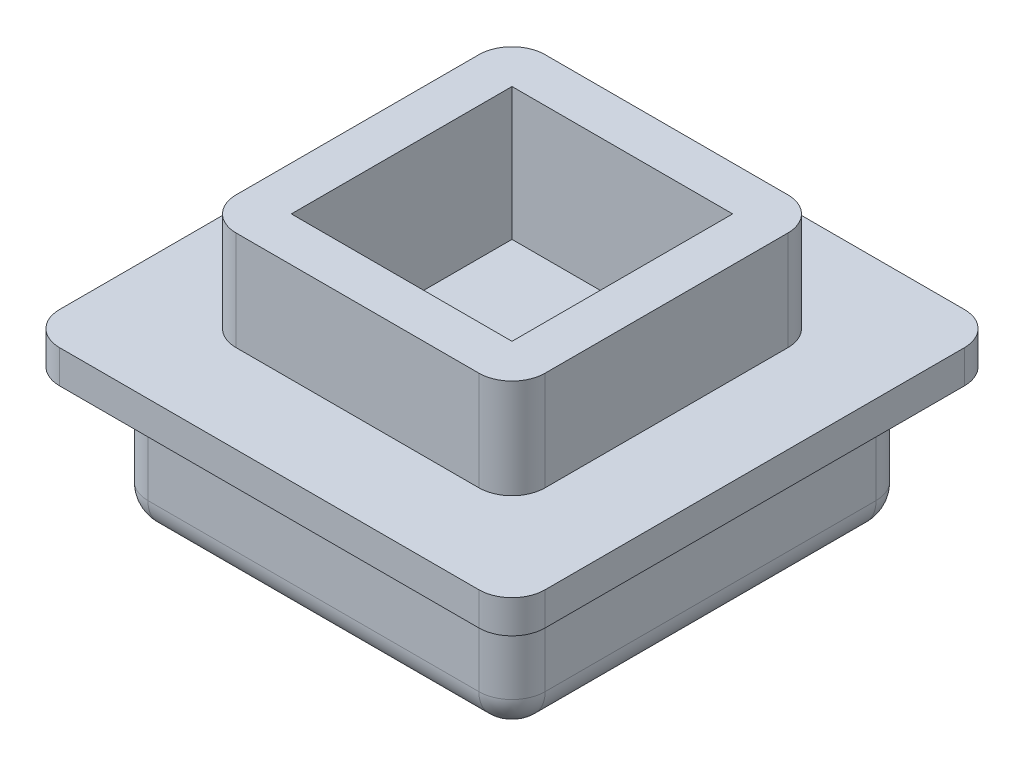
ISO-10303-21;
HEADER;
FILE_DESCRIPTION(('STEP AP214'),'2;1');
FILE_NAME('part.step','',(''),(''),'','','');
FILE_SCHEMA(('AUTOMOTIVE_DESIGN { 1 0 10303 214 1 1 1 1 }'));
ENDSEC;
DATA;
#1=APPLICATION_CONTEXT('core data for automotive mechanical design processes');
#2=APPLICATION_PROTOCOL_DEFINITION('international standard','automotive_design',2000,#1);
#3=PRODUCT_CONTEXT('',#1,'mechanical');
#4=PRODUCT('Part','Part','',(#3));
#5=PRODUCT_RELATED_PRODUCT_CATEGORY('part','',(#4));
#6=PRODUCT_DEFINITION_FORMATION('','',#4);
#7=PRODUCT_DEFINITION_CONTEXT('part definition',#1,'design');
#8=PRODUCT_DEFINITION('design','',#6,#7);
#9=PRODUCT_DEFINITION_SHAPE('','',#8);
#10=(LENGTH_UNIT() NAMED_UNIT(*) SI_UNIT(.MILLI.,.METRE.));
#11=(NAMED_UNIT(*) PLANE_ANGLE_UNIT() SI_UNIT($,.RADIAN.));
#12=(NAMED_UNIT(*) SI_UNIT($,.STERADIAN.) SOLID_ANGLE_UNIT());
#13=UNCERTAINTY_MEASURE_WITH_UNIT(LENGTH_MEASURE(1.E-05),#10,'distance_accuracy_value','');
#14=(GEOMETRIC_REPRESENTATION_CONTEXT(3) GLOBAL_UNCERTAINTY_ASSIGNED_CONTEXT((#13)) GLOBAL_UNIT_ASSIGNED_CONTEXT((#10,
#11,#12)) REPRESENTATION_CONTEXT('',''));
#15=CARTESIAN_POINT('',(0.,0.,0.));
#16=DIRECTION('',(0.,0.,1.));
#17=DIRECTION('',(1.,0.,0.));
#18=AXIS2_PLACEMENT_3D('',#15,#16,#17);
#19=CARTESIAN_POINT('',(4.5,3.,4.5));
#20=DIRECTION('',(-1.,0.,0.));
#21=DIRECTION('',(0.,0.,1.));
#22=AXIS2_PLACEMENT_3D('',#19,#20,#21);
#23=PLANE('',#22);
#24=DIRECTION('',(0.,-1.,0.));
#25=VECTOR('',#24,1.);
#26=CARTESIAN_POINT('',(4.5,3.,3.75));
#27=LINE('',#26,#25);
#28=CARTESIAN_POINT('',(4.5,3.,3.75));
#29=VERTEX_POINT('',#28);
#30=CARTESIAN_POINT('',(4.5,0.75,3.75));
#31=VERTEX_POINT('',#30);
#32=EDGE_CURVE('E412',#29,#31,#27,.T.);
#33=ORIENTED_EDGE('',*,*,#32,.T.);
#34=DIRECTION('',(0.,0.,-1.));
#35=VECTOR('',#34,1.);
#36=CARTESIAN_POINT('',(4.5,0.75,-3.75));
#37=LINE('',#36,#35);
#38=CARTESIAN_POINT('',(4.5,0.75,-3.75));
#39=VERTEX_POINT('',#38);
#40=EDGE_CURVE('E443',#31,#39,#37,.T.);
#41=ORIENTED_EDGE('',*,*,#40,.T.);
#42=DIRECTION('',(0.,-1.,0.));
#43=VECTOR('',#42,1.);
#44=CARTESIAN_POINT('',(4.5,3.,-3.75));
#45=LINE('',#44,#43);
#46=CARTESIAN_POINT('',(4.5,3.,-3.75));
#47=VERTEX_POINT('',#46);
#48=EDGE_CURVE('E411',#39,#47,#45,.F.);
#49=ORIENTED_EDGE('',*,*,#48,.T.);
#50=DIRECTION('',(0.,0.,-1.));
#51=VECTOR('',#50,1.);
#52=CARTESIAN_POINT('',(4.5,3.,4.5));
#53=LINE('',#52,#51);
#54=EDGE_CURVE('E324',#29,#47,#53,.T.);
#55=ORIENTED_EDGE('',*,*,#54,.F.);
#56=EDGE_LOOP('',(#33,#41,#49,#55));
#57=FACE_BOUND('',#56,.T.);
#58=ADVANCED_FACE('F43',(#57),#23,.F.);
#59=CARTESIAN_POINT('',(-4.5,3.,-4.5));
#60=DIRECTION('',(0.,0.,1.));
#61=DIRECTION('',(1.,0.,0.));
#62=AXIS2_PLACEMENT_3D('',#59,#60,#61);
#63=PLANE('',#62);
#64=DIRECTION('',(0.,-1.,0.));
#65=VECTOR('',#64,1.);
#66=CARTESIAN_POINT('',(3.75,3.,-4.5));
#67=LINE('',#66,#65);
#68=CARTESIAN_POINT('',(3.75,3.,-4.5));
#69=VERTEX_POINT('',#68);
#70=CARTESIAN_POINT('',(3.75,0.75,-4.5));
#71=VERTEX_POINT('',#70);
#72=EDGE_CURVE('E408',#69,#71,#67,.T.);
#73=ORIENTED_EDGE('',*,*,#72,.T.);
#74=DIRECTION('',(-1.,0.,0.));
#75=VECTOR('',#74,1.);
#76=CARTESIAN_POINT('',(-3.75,0.75,-4.5));
#77=LINE('',#76,#75);
#78=CARTESIAN_POINT('',(-3.75,0.75,-4.5));
#79=VERTEX_POINT('',#78);
#80=EDGE_CURVE('E11',#71,#79,#77,.T.);
#81=ORIENTED_EDGE('',*,*,#80,.T.);
#82=DIRECTION('',(0.,-1.,0.));
#83=VECTOR('',#82,1.);
#84=CARTESIAN_POINT('',(-3.75,3.,-4.5));
#85=LINE('',#84,#83);
#86=CARTESIAN_POINT('',(-3.75,3.,-4.5));
#87=VERTEX_POINT('',#86);
#88=EDGE_CURVE('E406',#79,#87,#85,.F.);
#89=ORIENTED_EDGE('',*,*,#88,.T.);
#90=DIRECTION('',(-1.,0.,0.));
#91=VECTOR('',#90,1.);
#92=CARTESIAN_POINT('',(-4.5,3.,-4.5));
#93=LINE('',#92,#91);
#94=EDGE_CURVE('E335',#69,#87,#93,.T.);
#95=ORIENTED_EDGE('',*,*,#94,.F.);
#96=EDGE_LOOP('',(#73,#81,#89,#95));
#97=FACE_BOUND('',#96,.T.);
#98=ADVANCED_FACE('F526',(#97),#63,.F.);
#99=CARTESIAN_POINT('',(-4.5,3.,4.5));
#100=DIRECTION('',(1.,0.,0.));
#101=DIRECTION('',(0.,0.,-1.));
#102=AXIS2_PLACEMENT_3D('',#99,#100,#101);
#103=PLANE('',#102);
#104=DIRECTION('',(0.,-1.,0.));
#105=VECTOR('',#104,1.);
#106=CARTESIAN_POINT('',(-4.5,3.,-3.75));
#107=LINE('',#106,#105);
#108=CARTESIAN_POINT('',(-4.5,3.,-3.75));
#109=VERTEX_POINT('',#108);
#110=CARTESIAN_POINT('',(-4.5,0.75,-3.75));
#111=VERTEX_POINT('',#110);
#112=EDGE_CURVE('E417',#109,#111,#107,.T.);
#113=ORIENTED_EDGE('',*,*,#112,.T.);
#114=DIRECTION('',(0.,0.,1.));
#115=VECTOR('',#114,1.);
#116=CARTESIAN_POINT('',(-4.5,0.75,3.75));
#117=LINE('',#116,#115);
#118=CARTESIAN_POINT('',(-4.5,0.75,3.75));
#119=VERTEX_POINT('',#118);
#120=EDGE_CURVE('E463',#111,#119,#117,.T.);
#121=ORIENTED_EDGE('',*,*,#120,.T.);
#122=DIRECTION('',(0.,-1.,0.));
#123=VECTOR('',#122,1.);
#124=CARTESIAN_POINT('',(-4.5,3.,3.75));
#125=LINE('',#124,#123);
#126=CARTESIAN_POINT('',(-4.5,3.,3.75));
#127=VERTEX_POINT('',#126);
#128=EDGE_CURVE('E418',#119,#127,#125,.F.);
#129=ORIENTED_EDGE('',*,*,#128,.T.);
#130=DIRECTION('',(0.,0.,1.));
#131=VECTOR('',#130,1.);
#132=CARTESIAN_POINT('',(-4.5,3.,4.5));
#133=LINE('',#132,#131);
#134=EDGE_CURVE('E340',#109,#127,#133,.T.);
#135=ORIENTED_EDGE('',*,*,#134,.F.);
#136=EDGE_LOOP('',(#113,#121,#129,#135));
#137=FACE_BOUND('',#136,.T.);
#138=ADVANCED_FACE('F533',(#137),#103,.F.);
#139=CARTESIAN_POINT('',(-4.5,3.,4.5));
#140=DIRECTION('',(0.,0.,-1.));
#141=DIRECTION('',(-1.,0.,0.));
#142=AXIS2_PLACEMENT_3D('',#139,#140,#141);
#143=PLANE('',#142);
#144=DIRECTION('',(0.,-1.,0.));
#145=VECTOR('',#144,1.);
#146=CARTESIAN_POINT('',(-3.75,3.,4.5));
#147=LINE('',#146,#145);
#148=CARTESIAN_POINT('',(-3.75,3.,4.5));
#149=VERTEX_POINT('',#148);
#150=CARTESIAN_POINT('',(-3.75,0.75,4.5));
#151=VERTEX_POINT('',#150);
#152=EDGE_CURVE('E422',#149,#151,#147,.T.);
#153=ORIENTED_EDGE('',*,*,#152,.T.);
#154=DIRECTION('',(1.,0.,0.));
#155=VECTOR('',#154,1.);
#156=CARTESIAN_POINT('',(3.75,0.75,4.5));
#157=LINE('',#156,#155);
#158=CARTESIAN_POINT('',(3.75,0.75,4.5));
#159=VERTEX_POINT('',#158);
#160=EDGE_CURVE('E460',#151,#159,#157,.T.);
#161=ORIENTED_EDGE('',*,*,#160,.T.);
#162=DIRECTION('',(0.,-1.,0.));
#163=VECTOR('',#162,1.);
#164=CARTESIAN_POINT('',(3.75,3.,4.5));
#165=LINE('',#164,#163);
#166=CARTESIAN_POINT('',(3.75,3.,4.5));
#167=VERTEX_POINT('',#166);
#168=EDGE_CURVE('E416',#159,#167,#165,.F.);
#169=ORIENTED_EDGE('',*,*,#168,.T.);
#170=DIRECTION('',(1.,0.,0.));
#171=VECTOR('',#170,1.);
#172=CARTESIAN_POINT('',(-4.5,3.,4.5));
#173=LINE('',#172,#171);
#174=EDGE_CURVE('E338',#149,#167,#173,.T.);
#175=ORIENTED_EDGE('',*,*,#174,.F.);
#176=EDGE_LOOP('',(#153,#161,#169,#175));
#177=FACE_BOUND('',#176,.T.);
#178=ADVANCED_FACE('F499',(#177),#143,.F.);
#179=CARTESIAN_POINT('',(0.,0.,0.));
#180=DIRECTION('',(0.,-1.,0.));
#181=DIRECTION('',(0.,0.,-1.));
#182=AXIS2_PLACEMENT_3D('',#179,#180,#181);
#183=PLANE('',#182);
#184=DIRECTION('',(-1.,0.,0.));
#185=VECTOR('',#184,1.);
#186=CARTESIAN_POINT('',(3.75,0.,-3.75));
#187=LINE('',#186,#185);
#188=CARTESIAN_POINT('',(-3.75,0.,-3.75));
#189=VERTEX_POINT('',#188);
#190=CARTESIAN_POINT('',(3.75,0.,-3.75));
#191=VERTEX_POINT('',#190);
#192=EDGE_CURVE('E447',#189,#191,#187,.F.);
#193=ORIENTED_EDGE('',*,*,#192,.T.);
#194=DIRECTION('',(0.,0.,-1.));
#195=VECTOR('',#194,1.);
#196=CARTESIAN_POINT('',(3.75,0.,3.75));
#197=LINE('',#196,#195);
#198=CARTESIAN_POINT('',(3.75,0.,3.75));
#199=VERTEX_POINT('',#198);
#200=EDGE_CURVE('E451',#191,#199,#197,.F.);
#201=ORIENTED_EDGE('',*,*,#200,.T.);
#202=DIRECTION('',(1.,0.,0.));
#203=VECTOR('',#202,1.);
#204=CARTESIAN_POINT('',(-3.75,0.,3.75));
#205=LINE('',#204,#203);
#206=CARTESIAN_POINT('',(-3.75,0.,3.75));
#207=VERTEX_POINT('',#206);
#208=EDGE_CURVE('E448',#199,#207,#205,.F.);
#209=ORIENTED_EDGE('',*,*,#208,.T.);
#210=DIRECTION('',(0.,0.,1.));
#211=VECTOR('',#210,1.);
#212=CARTESIAN_POINT('',(-3.75,0.,-3.75));
#213=LINE('',#212,#211);
#214=EDGE_CURVE('E449',#207,#189,#213,.F.);
#215=ORIENTED_EDGE('',*,*,#214,.T.);
#216=EDGE_LOOP('',(#193,#201,#209,#215));
#217=FACE_BOUND('',#216,.T.);
#218=ADVANCED_FACE('F545',(#217),#183,.T.);
#219=CARTESIAN_POINT('',(0.,3.,0.));
#220=DIRECTION('',(0.,1.,0.));
#221=DIRECTION('',(0.,0.,1.));
#222=AXIS2_PLACEMENT_3D('',#219,#220,#221);
#223=PLANE('',#222);
#224=DIRECTION('',(0.,0.,-1.));
#225=VECTOR('',#224,1.);
#226=CARTESIAN_POINT('',(5.5,3.,5.5));
#227=LINE('',#226,#225);
#228=CARTESIAN_POINT('',(5.5,3.,4.75));
#229=VERTEX_POINT('',#228);
#230=CARTESIAN_POINT('',(5.5,3.,-4.75));
#231=VERTEX_POINT('',#230);
#232=EDGE_CURVE('E323',#229,#231,#227,.T.);
#233=ORIENTED_EDGE('',*,*,#232,.F.);
#234=CARTESIAN_POINT('',(4.75,3.,4.75));
#235=DIRECTION('',(0.,1.,0.));
#236=DIRECTION('',(0.,0.,1.));
#237=AXIS2_PLACEMENT_3D('',#234,#235,#236);
#238=CIRCLE('',#237,0.75);
#239=CARTESIAN_POINT('',(4.75,3.,5.5));
#240=VERTEX_POINT('',#239);
#241=EDGE_CURVE('E385',#229,#240,#238,.F.);
#242=ORIENTED_EDGE('',*,*,#241,.T.);
#243=DIRECTION('',(1.,0.,0.));
#244=VECTOR('',#243,1.);
#245=CARTESIAN_POINT('',(-5.5,3.,5.5));
#246=LINE('',#245,#244);
#247=CARTESIAN_POINT('',(-4.75,3.,5.5));
#248=VERTEX_POINT('',#247);
#249=EDGE_CURVE('E300',#248,#240,#246,.T.);
#250=ORIENTED_EDGE('',*,*,#249,.F.);
#251=CARTESIAN_POINT('',(-4.75,3.,4.75));
#252=DIRECTION('',(0.,1.,0.));
#253=DIRECTION('',(0.,0.,1.));
#254=AXIS2_PLACEMENT_3D('',#251,#252,#253);
#255=CIRCLE('',#254,0.75);
#256=CARTESIAN_POINT('',(-5.5,3.,4.75));
#257=VERTEX_POINT('',#256);
#258=EDGE_CURVE('E379',#248,#257,#255,.F.);
#259=ORIENTED_EDGE('',*,*,#258,.T.);
#260=DIRECTION('',(0.,0.,1.));
#261=VECTOR('',#260,1.);
#262=CARTESIAN_POINT('',(-5.5,3.,-5.5));
#263=LINE('',#262,#261);
#264=CARTESIAN_POINT('',(-5.5,3.,-4.75));
#265=VERTEX_POINT('',#264);
#266=EDGE_CURVE('E315',#265,#257,#263,.T.);
#267=ORIENTED_EDGE('',*,*,#266,.F.);
#268=CARTESIAN_POINT('',(-4.75,3.,-4.75));
#269=DIRECTION('',(0.,1.,0.));
#270=DIRECTION('',(0.,0.,1.));
#271=AXIS2_PLACEMENT_3D('',#268,#269,#270);
#272=CIRCLE('',#271,0.75);
#273=CARTESIAN_POINT('',(-4.75,3.,-5.5));
#274=VERTEX_POINT('',#273);
#275=EDGE_CURVE('E377',#265,#274,#272,.F.);
#276=ORIENTED_EDGE('',*,*,#275,.T.);
#277=DIRECTION('',(-1.,0.,0.));
#278=VECTOR('',#277,1.);
#279=CARTESIAN_POINT('',(5.5,3.,-5.5));
#280=LINE('',#279,#278);
#281=CARTESIAN_POINT('',(4.75,3.,-5.5));
#282=VERTEX_POINT('',#281);
#283=EDGE_CURVE('E330',#282,#274,#280,.T.);
#284=ORIENTED_EDGE('',*,*,#283,.F.);
#285=CARTESIAN_POINT('',(4.75,3.,-4.75));
#286=DIRECTION('',(0.,1.,0.));
#287=DIRECTION('',(0.,0.,1.));
#288=AXIS2_PLACEMENT_3D('',#285,#286,#287);
#289=CIRCLE('',#288,0.75);
#290=EDGE_CURVE('E376',#282,#231,#289,.F.);
#291=ORIENTED_EDGE('',*,*,#290,.T.);
#292=EDGE_LOOP('',(#233,#242,#250,#259,#267,#276,#284,#291));
#293=FACE_BOUND('',#292,.T.);
#294=ORIENTED_EDGE('',*,*,#134,.T.);
#295=CARTESIAN_POINT('',(-3.75,3.,3.75));
#296=DIRECTION('',(0.,1.,0.));
#297=DIRECTION('',(0.,0.,1.));
#298=AXIS2_PLACEMENT_3D('',#295,#296,#297);
#299=CIRCLE('',#298,0.75);
#300=EDGE_CURVE('E440',#127,#149,#299,.T.);
#301=ORIENTED_EDGE('',*,*,#300,.T.);
#302=ORIENTED_EDGE('',*,*,#174,.T.);
#303=CARTESIAN_POINT('',(3.75,3.,3.75));
#304=DIRECTION('',(0.,1.,0.));
#305=DIRECTION('',(0.,0.,1.));
#306=AXIS2_PLACEMENT_3D('',#303,#304,#305);
#307=CIRCLE('',#306,0.75);
#308=EDGE_CURVE('E437',#167,#29,#307,.T.);
#309=ORIENTED_EDGE('',*,*,#308,.T.);
#310=ORIENTED_EDGE('',*,*,#54,.T.);
#311=CARTESIAN_POINT('',(3.75,3.,-3.75));
#312=DIRECTION('',(0.,1.,0.));
#313=DIRECTION('',(0.,0.,1.));
#314=AXIS2_PLACEMENT_3D('',#311,#312,#313);
#315=CIRCLE('',#314,0.75);
#316=EDGE_CURVE('E433',#47,#69,#315,.T.);
#317=ORIENTED_EDGE('',*,*,#316,.T.);
#318=ORIENTED_EDGE('',*,*,#94,.T.);
#319=CARTESIAN_POINT('',(-3.75,3.,-3.75));
#320=DIRECTION('',(0.,1.,0.));
#321=DIRECTION('',(0.,0.,1.));
#322=AXIS2_PLACEMENT_3D('',#319,#320,#321);
#323=CIRCLE('',#322,0.75);
#324=EDGE_CURVE('E434',#87,#109,#323,.T.);
#325=ORIENTED_EDGE('',*,*,#324,.T.);
#326=EDGE_LOOP('',(#294,#301,#302,#309,#310,#317,#318,#325));
#327=FACE_BOUND('',#326,.T.);
#328=ADVANCED_FACE('F502',(#293,#327),#223,.F.);
#329=CARTESIAN_POINT('',(-5.5,3.75,5.5));
#330=DIRECTION('',(0.,0.,-1.));
#331=DIRECTION('',(-1.,0.,0.));
#332=AXIS2_PLACEMENT_3D('',#329,#330,#331);
#333=PLANE('',#332);
#334=ORIENTED_EDGE('',*,*,#249,.T.);
#335=DIRECTION('',(0.,-1.,0.));
#336=VECTOR('',#335,1.);
#337=CARTESIAN_POINT('',(4.75,3.75,5.5));
#338=LINE('',#337,#336);
#339=CARTESIAN_POINT('',(4.75,3.75,5.5));
#340=VERTEX_POINT('',#339);
#341=EDGE_CURVE('E386',#240,#340,#338,.F.);
#342=ORIENTED_EDGE('',*,*,#341,.T.);
#343=DIRECTION('',(1.,0.,0.));
#344=VECTOR('',#343,1.);
#345=CARTESIAN_POINT('',(-5.5,3.75,5.5));
#346=LINE('',#345,#344);
#347=CARTESIAN_POINT('',(-4.75,3.75,5.5));
#348=VERTEX_POINT('',#347);
#349=EDGE_CURVE('E308',#348,#340,#346,.T.);
#350=ORIENTED_EDGE('',*,*,#349,.F.);
#351=DIRECTION('',(0.,-1.,0.));
#352=VECTOR('',#351,1.);
#353=CARTESIAN_POINT('',(-4.75,3.75,5.5));
#354=LINE('',#353,#352);
#355=EDGE_CURVE('E381',#348,#248,#354,.T.);
#356=ORIENTED_EDGE('',*,*,#355,.T.);
#357=EDGE_LOOP('',(#334,#342,#350,#356));
#358=FACE_BOUND('',#357,.T.);
#359=ADVANCED_FACE('F672',(#358),#333,.F.);
#360=CARTESIAN_POINT('',(5.5,3.75,5.5));
#361=DIRECTION('',(-1.,0.,0.));
#362=DIRECTION('',(0.,0.,1.));
#363=AXIS2_PLACEMENT_3D('',#360,#361,#362);
#364=PLANE('',#363);
#365=DIRECTION('',(0.,0.,-1.));
#366=VECTOR('',#365,1.);
#367=CARTESIAN_POINT('',(5.5,3.75,5.5));
#368=LINE('',#367,#366);
#369=CARTESIAN_POINT('',(5.5,3.75,4.75));
#370=VERTEX_POINT('',#369);
#371=CARTESIAN_POINT('',(5.5,3.75,-4.75));
#372=VERTEX_POINT('',#371);
#373=EDGE_CURVE('E311',#370,#372,#368,.T.);
#374=ORIENTED_EDGE('',*,*,#373,.F.);
#375=DIRECTION('',(0.,-1.,0.));
#376=VECTOR('',#375,1.);
#377=CARTESIAN_POINT('',(5.5,3.75,4.75));
#378=LINE('',#377,#376);
#379=EDGE_CURVE('E373',#370,#229,#378,.T.);
#380=ORIENTED_EDGE('',*,*,#379,.T.);
#381=ORIENTED_EDGE('',*,*,#232,.T.);
#382=DIRECTION('',(0.,-1.,0.));
#383=VECTOR('',#382,1.);
#384=CARTESIAN_POINT('',(5.5,3.75,-4.75));
#385=LINE('',#384,#383);
#386=EDGE_CURVE('E371',#231,#372,#385,.F.);
#387=ORIENTED_EDGE('',*,*,#386,.T.);
#388=EDGE_LOOP('',(#374,#380,#381,#387));
#389=FACE_BOUND('',#388,.T.);
#390=ADVANCED_FACE('F676',(#389),#364,.F.);
#391=CARTESIAN_POINT('',(5.5,3.75,-5.5));
#392=DIRECTION('',(0.,0.,1.));
#393=DIRECTION('',(1.,0.,0.));
#394=AXIS2_PLACEMENT_3D('',#391,#392,#393);
#395=PLANE('',#394);
#396=ORIENTED_EDGE('',*,*,#283,.T.);
#397=DIRECTION('',(0.,-1.,0.));
#398=VECTOR('',#397,1.);
#399=CARTESIAN_POINT('',(-4.75,3.75,-5.5));
#400=LINE('',#399,#398);
#401=CARTESIAN_POINT('',(-4.75,3.75,-5.5));
#402=VERTEX_POINT('',#401);
#403=EDGE_CURVE('E403',#274,#402,#400,.F.);
#404=ORIENTED_EDGE('',*,*,#403,.T.);
#405=DIRECTION('',(-1.,0.,0.));
#406=VECTOR('',#405,1.);
#407=CARTESIAN_POINT('',(5.5,3.75,-5.5));
#408=LINE('',#407,#406);
#409=CARTESIAN_POINT('',(4.75,3.75,-5.5));
#410=VERTEX_POINT('',#409);
#411=EDGE_CURVE('E314',#410,#402,#408,.T.);
#412=ORIENTED_EDGE('',*,*,#411,.F.);
#413=DIRECTION('',(0.,-1.,0.));
#414=VECTOR('',#413,1.);
#415=CARTESIAN_POINT('',(4.75,3.75,-5.5));
#416=LINE('',#415,#414);
#417=EDGE_CURVE('E405',#410,#282,#416,.T.);
#418=ORIENTED_EDGE('',*,*,#417,.T.);
#419=EDGE_LOOP('',(#396,#404,#412,#418));
#420=FACE_BOUND('',#419,.T.);
#421=ADVANCED_FACE('F689',(#420),#395,.F.);
#422=CARTESIAN_POINT('',(-5.5,3.75,-5.5));
#423=DIRECTION('',(1.,0.,0.));
#424=DIRECTION('',(0.,0.,-1.));
#425=AXIS2_PLACEMENT_3D('',#422,#423,#424);
#426=PLANE('',#425);
#427=ORIENTED_EDGE('',*,*,#266,.T.);
#428=DIRECTION('',(0.,-1.,0.));
#429=VECTOR('',#428,1.);
#430=CARTESIAN_POINT('',(-5.5,3.75,4.75));
#431=LINE('',#430,#429);
#432=CARTESIAN_POINT('',(-5.5,3.75,4.75));
#433=VERTEX_POINT('',#432);
#434=EDGE_CURVE('E396',#257,#433,#431,.F.);
#435=ORIENTED_EDGE('',*,*,#434,.T.);
#436=DIRECTION('',(0.,0.,1.));
#437=VECTOR('',#436,1.);
#438=CARTESIAN_POINT('',(-5.5,3.75,-5.5));
#439=LINE('',#438,#437);
#440=CARTESIAN_POINT('',(-5.5,3.75,-4.75));
#441=VERTEX_POINT('',#440);
#442=EDGE_CURVE('E319',#441,#433,#439,.T.);
#443=ORIENTED_EDGE('',*,*,#442,.F.);
#444=DIRECTION('',(0.,-1.,0.));
#445=VECTOR('',#444,1.);
#446=CARTESIAN_POINT('',(-5.5,3.75,-4.75));
#447=LINE('',#446,#445);
#448=EDGE_CURVE('E399',#441,#265,#447,.T.);
#449=ORIENTED_EDGE('',*,*,#448,.T.);
#450=EDGE_LOOP('',(#427,#435,#443,#449));
#451=FACE_BOUND('',#450,.T.);
#452=ADVANCED_FACE('F698',(#451),#426,.F.);
#453=CARTESIAN_POINT('',(0.,3.75,0.));
#454=DIRECTION('',(0.,1.,0.));
#455=DIRECTION('',(0.,0.,1.));
#456=AXIS2_PLACEMENT_3D('',#453,#454,#455);
#457=PLANE('',#456);
#458=DIRECTION('',(0.,0.,1.));
#459=VECTOR('',#458,1.);
#460=CARTESIAN_POINT('',(-3.5,3.75,3.5));
#461=LINE('',#460,#459);
#462=CARTESIAN_POINT('',(-3.5,3.75,-2.75));
#463=VERTEX_POINT('',#462);
#464=CARTESIAN_POINT('',(-3.5,3.75,2.75));
#465=VERTEX_POINT('',#464);
#466=EDGE_CURVE('E284',#463,#465,#461,.T.);
#467=ORIENTED_EDGE('',*,*,#466,.F.);
#468=CARTESIAN_POINT('',(-2.75,3.75,-2.75));
#469=DIRECTION('',(0.,1.,0.));
#470=DIRECTION('',(0.,0.,1.));
#471=AXIS2_PLACEMENT_3D('',#468,#469,#470);
#472=CIRCLE('',#471,0.75);
#473=CARTESIAN_POINT('',(-2.75,3.75,-3.5));
#474=VERTEX_POINT('',#473);
#475=EDGE_CURVE('E430',#463,#474,#472,.F.);
#476=ORIENTED_EDGE('',*,*,#475,.T.);
#477=DIRECTION('',(-1.,0.,0.));
#478=VECTOR('',#477,1.);
#479=CARTESIAN_POINT('',(-3.5,3.75,-3.5));
#480=LINE('',#479,#478);
#481=CARTESIAN_POINT('',(2.75,3.75,-3.5));
#482=VERTEX_POINT('',#481);
#483=EDGE_CURVE('E287',#482,#474,#480,.T.);
#484=ORIENTED_EDGE('',*,*,#483,.F.);
#485=CARTESIAN_POINT('',(2.75,3.75,-2.75));
#486=DIRECTION('',(0.,1.,0.));
#487=DIRECTION('',(0.,0.,1.));
#488=AXIS2_PLACEMENT_3D('',#485,#486,#487);
#489=CIRCLE('',#488,0.75);
#490=CARTESIAN_POINT('',(3.5,3.75,-2.75));
#491=VERTEX_POINT('',#490);
#492=EDGE_CURVE('E429',#482,#491,#489,.F.);
#493=ORIENTED_EDGE('',*,*,#492,.T.);
#494=DIRECTION('',(0.,0.,-1.));
#495=VECTOR('',#494,1.);
#496=CARTESIAN_POINT('',(3.5,3.75,3.5));
#497=LINE('',#496,#495);
#498=CARTESIAN_POINT('',(3.5,3.75,2.75));
#499=VERTEX_POINT('',#498);
#500=EDGE_CURVE('E303',#499,#491,#497,.T.);
#501=ORIENTED_EDGE('',*,*,#500,.F.);
#502=CARTESIAN_POINT('',(2.75,3.75,2.75));
#503=DIRECTION('',(0.,1.,0.));
#504=DIRECTION('',(0.,0.,1.));
#505=AXIS2_PLACEMENT_3D('',#502,#503,#504);
#506=CIRCLE('',#505,0.75);
#507=CARTESIAN_POINT('',(2.75,3.75,3.5));
#508=VERTEX_POINT('',#507);
#509=EDGE_CURVE('E431',#499,#508,#506,.F.);
#510=ORIENTED_EDGE('',*,*,#509,.T.);
#511=DIRECTION('',(1.,0.,0.));
#512=VECTOR('',#511,1.);
#513=CARTESIAN_POINT('',(-3.5,3.75,3.5));
#514=LINE('',#513,#512);
#515=CARTESIAN_POINT('',(-2.75,3.75,3.5));
#516=VERTEX_POINT('',#515);
#517=EDGE_CURVE('E297',#516,#508,#514,.T.);
#518=ORIENTED_EDGE('',*,*,#517,.F.);
#519=CARTESIAN_POINT('',(-2.75,3.75,2.75));
#520=DIRECTION('',(0.,1.,0.));
#521=DIRECTION('',(0.,0.,1.));
#522=AXIS2_PLACEMENT_3D('',#519,#520,#521);
#523=CIRCLE('',#522,0.75);
#524=EDGE_CURVE('E424',#516,#465,#523,.F.);
#525=ORIENTED_EDGE('',*,*,#524,.T.);
#526=EDGE_LOOP('',(#467,#476,#484,#493,#501,#510,#518,#525));
#527=FACE_BOUND('',#526,.T.);
#528=ORIENTED_EDGE('',*,*,#349,.T.);
#529=CARTESIAN_POINT('',(4.75,3.75,4.75));
#530=DIRECTION('',(0.,1.,0.));
#531=DIRECTION('',(0.,0.,1.));
#532=AXIS2_PLACEMENT_3D('',#529,#530,#531);
#533=CIRCLE('',#532,0.75);
#534=EDGE_CURVE('E393',#340,#370,#533,.T.);
#535=ORIENTED_EDGE('',*,*,#534,.T.);
#536=ORIENTED_EDGE('',*,*,#373,.T.);
#537=CARTESIAN_POINT('',(4.75,3.75,-4.75));
#538=DIRECTION('',(0.,1.,0.));
#539=DIRECTION('',(0.,0.,1.));
#540=AXIS2_PLACEMENT_3D('',#537,#538,#539);
#541=CIRCLE('',#540,0.75);
#542=EDGE_CURVE('E388',#372,#410,#541,.T.);
#543=ORIENTED_EDGE('',*,*,#542,.T.);
#544=ORIENTED_EDGE('',*,*,#411,.T.);
#545=CARTESIAN_POINT('',(-4.75,3.75,-4.75));
#546=DIRECTION('',(0.,1.,0.));
#547=DIRECTION('',(0.,0.,1.));
#548=AXIS2_PLACEMENT_3D('',#545,#546,#547);
#549=CIRCLE('',#548,0.75);
#550=EDGE_CURVE('E392',#402,#441,#549,.T.);
#551=ORIENTED_EDGE('',*,*,#550,.T.);
#552=ORIENTED_EDGE('',*,*,#442,.T.);
#553=CARTESIAN_POINT('',(-4.75,3.75,4.75));
#554=DIRECTION('',(0.,1.,0.));
#555=DIRECTION('',(0.,0.,1.));
#556=AXIS2_PLACEMENT_3D('',#553,#554,#555);
#557=CIRCLE('',#556,0.75);
#558=EDGE_CURVE('E394',#433,#348,#557,.T.);
#559=ORIENTED_EDGE('',*,*,#558,.T.);
#560=EDGE_LOOP('',(#528,#535,#536,#543,#544,#551,#552,#559));
#561=FACE_BOUND('',#560,.T.);
#562=ADVANCED_FACE('F710',(#527,#561),#457,.T.);
#563=CARTESIAN_POINT('',(0.,6.,0.));
#564=DIRECTION('',(0.,-1.,0.));
#565=DIRECTION('',(0.,0.,-1.));
#566=AXIS2_PLACEMENT_3D('',#563,#564,#565);
#567=PLANE('',#566);
#568=DIRECTION('',(0.,0.,1.));
#569=VECTOR('',#568,1.);
#570=CARTESIAN_POINT('',(-3.5,6.,3.5));
#571=LINE('',#570,#569);
#572=CARTESIAN_POINT('',(-3.5,6.,-2.75));
#573=VERTEX_POINT('',#572);
#574=CARTESIAN_POINT('',(-3.5,6.,2.75));
#575=VERTEX_POINT('',#574);
#576=EDGE_CURVE('E281',#573,#575,#571,.T.);
#577=ORIENTED_EDGE('',*,*,#576,.T.);
#578=CARTESIAN_POINT('',(-2.75,6.,2.75));
#579=DIRECTION('',(0.,-1.,0.));
#580=DIRECTION('',(0.,0.,-1.));
#581=AXIS2_PLACEMENT_3D('',#578,#579,#580);
#582=CIRCLE('',#581,0.75);
#583=CARTESIAN_POINT('',(-2.75,6.,3.5));
#584=VERTEX_POINT('',#583);
#585=EDGE_CURVE('E360',#575,#584,#582,.F.);
#586=ORIENTED_EDGE('',*,*,#585,.T.);
#587=DIRECTION('',(1.,0.,0.));
#588=VECTOR('',#587,1.);
#589=CARTESIAN_POINT('',(-3.5,6.,3.5));
#590=LINE('',#589,#588);
#591=CARTESIAN_POINT('',(2.75,6.,3.5));
#592=VERTEX_POINT('',#591);
#593=EDGE_CURVE('E289',#584,#592,#590,.T.);
#594=ORIENTED_EDGE('',*,*,#593,.T.);
#595=CARTESIAN_POINT('',(2.75,6.,2.75));
#596=DIRECTION('',(0.,-1.,0.));
#597=DIRECTION('',(0.,0.,-1.));
#598=AXIS2_PLACEMENT_3D('',#595,#596,#597);
#599=CIRCLE('',#598,0.75);
#600=CARTESIAN_POINT('',(3.5,6.,2.75));
#601=VERTEX_POINT('',#600);
#602=EDGE_CURVE('E352',#592,#601,#599,.F.);
#603=ORIENTED_EDGE('',*,*,#602,.T.);
#604=DIRECTION('',(0.,0.,-1.));
#605=VECTOR('',#604,1.);
#606=CARTESIAN_POINT('',(3.5,6.,3.5));
#607=LINE('',#606,#605);
#608=CARTESIAN_POINT('',(3.5,6.,-2.75));
#609=VERTEX_POINT('',#608);
#610=EDGE_CURVE('E293',#601,#609,#607,.T.);
#611=ORIENTED_EDGE('',*,*,#610,.T.);
#612=CARTESIAN_POINT('',(2.75,6.,-2.75));
#613=DIRECTION('',(0.,-1.,0.));
#614=DIRECTION('',(0.,0.,-1.));
#615=AXIS2_PLACEMENT_3D('',#612,#613,#614);
#616=CIRCLE('',#615,0.75);
#617=CARTESIAN_POINT('',(2.75,6.,-3.5));
#618=VERTEX_POINT('',#617);
#619=EDGE_CURVE('E351',#609,#618,#616,.F.);
#620=ORIENTED_EDGE('',*,*,#619,.T.);
#621=DIRECTION('',(-1.,0.,0.));
#622=VECTOR('',#621,1.);
#623=CARTESIAN_POINT('',(-3.5,6.,-3.5));
#624=LINE('',#623,#622);
#625=CARTESIAN_POINT('',(-2.75,6.,-3.5));
#626=VERTEX_POINT('',#625);
#627=EDGE_CURVE('E295',#618,#626,#624,.T.);
#628=ORIENTED_EDGE('',*,*,#627,.T.);
#629=CARTESIAN_POINT('',(-2.75,6.,-2.75));
#630=DIRECTION('',(0.,-1.,0.));
#631=DIRECTION('',(0.,0.,-1.));
#632=AXIS2_PLACEMENT_3D('',#629,#630,#631);
#633=CIRCLE('',#632,0.75);
#634=EDGE_CURVE('E357',#626,#573,#633,.F.);
#635=ORIENTED_EDGE('',*,*,#634,.T.);
#636=EDGE_LOOP('',(#577,#586,#594,#603,#611,#620,#628,#635));
#637=FACE_BOUND('',#636,.T.);
#638=DIRECTION('',(0.,0.,-1.));
#639=VECTOR('',#638,1.);
#640=CARTESIAN_POINT('',(2.5,6.,2.5));
#641=LINE('',#640,#639);
#642=CARTESIAN_POINT('',(2.5,6.,2.5));
#643=VERTEX_POINT('',#642);
#644=CARTESIAN_POINT('',(2.5,6.,-2.5));
#645=VERTEX_POINT('',#644);
#646=EDGE_CURVE('E275',#643,#645,#641,.T.);
#647=ORIENTED_EDGE('',*,*,#646,.F.);
#648=DIRECTION('',(1.,0.,0.));
#649=VECTOR('',#648,1.);
#650=CARTESIAN_POINT('',(-2.5,6.,2.5));
#651=LINE('',#650,#649);
#652=CARTESIAN_POINT('',(-2.5,6.,2.5));
#653=VERTEX_POINT('',#652);
#654=EDGE_CURVE('E276',#653,#643,#651,.T.);
#655=ORIENTED_EDGE('',*,*,#654,.F.);
#656=DIRECTION('',(0.,0.,1.));
#657=VECTOR('',#656,1.);
#658=CARTESIAN_POINT('',(-2.5,6.,2.5));
#659=LINE('',#658,#657);
#660=CARTESIAN_POINT('',(-2.5,6.,-2.5));
#661=VERTEX_POINT('',#660);
#662=EDGE_CURVE('E273',#661,#653,#659,.T.);
#663=ORIENTED_EDGE('',*,*,#662,.F.);
#664=DIRECTION('',(-1.,0.,0.));
#665=VECTOR('',#664,1.);
#666=CARTESIAN_POINT('',(-2.5,6.,-2.5));
#667=LINE('',#666,#665);
#668=EDGE_CURVE('E248',#645,#661,#667,.T.);
#669=ORIENTED_EDGE('',*,*,#668,.F.);
#670=EDGE_LOOP('',(#647,#655,#663,#669));
#671=FACE_BOUND('',#670,.T.);
#672=ADVANCED_FACE('F717',(#637,#671),#567,.F.);
#673=CARTESIAN_POINT('',(-3.5,6.,3.5));
#674=DIRECTION('',(1.,0.,0.));
#675=DIRECTION('',(0.,0.,-1.));
#676=AXIS2_PLACEMENT_3D('',#673,#674,#675);
#677=PLANE('',#676);
#678=ORIENTED_EDGE('',*,*,#466,.T.);
#679=DIRECTION('',(0.,-1.,0.));
#680=VECTOR('',#679,1.);
#681=CARTESIAN_POINT('',(-3.5,6.,2.75));
#682=LINE('',#681,#680);
#683=EDGE_CURVE('E353',#465,#575,#682,.F.);
#684=ORIENTED_EDGE('',*,*,#683,.T.);
#685=ORIENTED_EDGE('',*,*,#576,.F.);
#686=DIRECTION('',(0.,-1.,0.));
#687=VECTOR('',#686,1.);
#688=CARTESIAN_POINT('',(-3.5,6.,-2.75));
#689=LINE('',#688,#687);
#690=EDGE_CURVE('E349',#573,#463,#689,.T.);
#691=ORIENTED_EDGE('',*,*,#690,.T.);
#692=EDGE_LOOP('',(#678,#684,#685,#691));
#693=FACE_BOUND('',#692,.T.);
#694=ADVANCED_FACE('F721',(#693),#677,.F.);
#695=CARTESIAN_POINT('',(-3.5,6.,3.5));
#696=DIRECTION('',(0.,0.,-1.));
#697=DIRECTION('',(-1.,0.,0.));
#698=AXIS2_PLACEMENT_3D('',#695,#696,#697);
#699=PLANE('',#698);
#700=ORIENTED_EDGE('',*,*,#593,.F.);
#701=DIRECTION('',(0.,-1.,0.));
#702=VECTOR('',#701,1.);
#703=CARTESIAN_POINT('',(-2.75,6.,3.5));
#704=LINE('',#703,#702);
#705=EDGE_CURVE('E342',#584,#516,#704,.T.);
#706=ORIENTED_EDGE('',*,*,#705,.T.);
#707=ORIENTED_EDGE('',*,*,#517,.T.);
#708=DIRECTION('',(0.,-1.,0.));
#709=VECTOR('',#708,1.);
#710=CARTESIAN_POINT('',(2.75,6.,3.5));
#711=LINE('',#710,#709);
#712=EDGE_CURVE('E345',#508,#592,#711,.F.);
#713=ORIENTED_EDGE('',*,*,#712,.T.);
#714=EDGE_LOOP('',(#700,#706,#707,#713));
#715=FACE_BOUND('',#714,.T.);
#716=ADVANCED_FACE('F733',(#715),#699,.F.);
#717=CARTESIAN_POINT('',(3.5,6.,3.5));
#718=DIRECTION('',(-1.,0.,0.));
#719=DIRECTION('',(0.,0.,1.));
#720=AXIS2_PLACEMENT_3D('',#717,#718,#719);
#721=PLANE('',#720);
#722=ORIENTED_EDGE('',*,*,#500,.T.);
#723=DIRECTION('',(0.,-1.,0.));
#724=VECTOR('',#723,1.);
#725=CARTESIAN_POINT('',(3.5,6.,-2.75));
#726=LINE('',#725,#724);
#727=EDGE_CURVE('E367',#491,#609,#726,.F.);
#728=ORIENTED_EDGE('',*,*,#727,.T.);
#729=ORIENTED_EDGE('',*,*,#610,.F.);
#730=DIRECTION('',(0.,-1.,0.));
#731=VECTOR('',#730,1.);
#732=CARTESIAN_POINT('',(3.5,6.,2.75));
#733=LINE('',#732,#731);
#734=EDGE_CURVE('E366',#601,#499,#733,.T.);
#735=ORIENTED_EDGE('',*,*,#734,.T.);
#736=EDGE_LOOP('',(#722,#728,#729,#735));
#737=FACE_BOUND('',#736,.T.);
#738=ADVANCED_FACE('F742',(#737),#721,.F.);
#739=CARTESIAN_POINT('',(-3.5,6.,-3.5));
#740=DIRECTION('',(0.,0.,1.));
#741=DIRECTION('',(1.,0.,0.));
#742=AXIS2_PLACEMENT_3D('',#739,#740,#741);
#743=PLANE('',#742);
#744=ORIENTED_EDGE('',*,*,#483,.T.);
#745=DIRECTION('',(0.,-1.,0.));
#746=VECTOR('',#745,1.);
#747=CARTESIAN_POINT('',(-2.75,6.,-3.5));
#748=LINE('',#747,#746);
#749=EDGE_CURVE('E364',#474,#626,#748,.F.);
#750=ORIENTED_EDGE('',*,*,#749,.T.);
#751=ORIENTED_EDGE('',*,*,#627,.F.);
#752=DIRECTION('',(0.,-1.,0.));
#753=VECTOR('',#752,1.);
#754=CARTESIAN_POINT('',(2.75,6.,-3.5));
#755=LINE('',#754,#753);
#756=EDGE_CURVE('E363',#618,#482,#755,.T.);
#757=ORIENTED_EDGE('',*,*,#756,.T.);
#758=EDGE_LOOP('',(#744,#750,#751,#757));
#759=FACE_BOUND('',#758,.T.);
#760=ADVANCED_FACE('F755',(#759),#743,.F.);
#761=CARTESIAN_POINT('',(2.5,6.,2.5));
#762=DIRECTION('',(-1.,0.,0.));
#763=DIRECTION('',(0.,0.,1.));
#764=AXIS2_PLACEMENT_3D('',#761,#762,#763);
#765=PLANE('',#764);
#766=DIRECTION('',(0.,-1.,0.));
#767=VECTOR('',#766,1.);
#768=CARTESIAN_POINT('',(2.5,6.,-2.5));
#769=LINE('',#768,#767);
#770=CARTESIAN_POINT('',(2.5,3.,-2.5));
#771=VERTEX_POINT('',#770);
#772=EDGE_CURVE('E254',#645,#771,#769,.T.);
#773=ORIENTED_EDGE('',*,*,#772,.T.);
#774=DIRECTION('',(0.,0.,-1.));
#775=VECTOR('',#774,1.);
#776=CARTESIAN_POINT('',(2.5,3.,2.5));
#777=LINE('',#776,#775);
#778=CARTESIAN_POINT('',(2.5,3.,2.5));
#779=VERTEX_POINT('',#778);
#780=EDGE_CURVE('E268',#779,#771,#777,.T.);
#781=ORIENTED_EDGE('',*,*,#780,.F.);
#782=DIRECTION('',(0.,-1.,0.));
#783=VECTOR('',#782,1.);
#784=CARTESIAN_POINT('',(2.5,6.,2.5));
#785=LINE('',#784,#783);
#786=EDGE_CURVE('E278',#643,#779,#785,.T.);
#787=ORIENTED_EDGE('',*,*,#786,.F.);
#788=ORIENTED_EDGE('',*,*,#646,.T.);
#789=EDGE_LOOP('',(#773,#781,#787,#788));
#790=FACE_BOUND('',#789,.T.);
#791=ADVANCED_FACE('F761',(#790),#765,.T.);
#792=CARTESIAN_POINT('',(-2.5,6.,-2.5));
#793=DIRECTION('',(0.,0.,1.));
#794=DIRECTION('',(1.,0.,0.));
#795=AXIS2_PLACEMENT_3D('',#792,#793,#794);
#796=PLANE('',#795);
#797=DIRECTION('',(0.,-1.,0.));
#798=VECTOR('',#797,1.);
#799=CARTESIAN_POINT('',(-2.5,6.,-2.5));
#800=LINE('',#799,#798);
#801=CARTESIAN_POINT('',(-2.5,3.,-2.5));
#802=VERTEX_POINT('',#801);
#803=EDGE_CURVE('E241',#661,#802,#800,.T.);
#804=ORIENTED_EDGE('',*,*,#803,.T.);
#805=DIRECTION('',(-1.,0.,0.));
#806=VECTOR('',#805,1.);
#807=CARTESIAN_POINT('',(2.5,3.,-2.5));
#808=LINE('',#807,#806);
#809=EDGE_CURVE('E246',#771,#802,#808,.T.);
#810=ORIENTED_EDGE('',*,*,#809,.F.);
#811=ORIENTED_EDGE('',*,*,#772,.F.);
#812=ORIENTED_EDGE('',*,*,#668,.T.);
#813=EDGE_LOOP('',(#804,#810,#811,#812));
#814=FACE_BOUND('',#813,.T.);
#815=ADVANCED_FACE('F243',(#814),#796,.T.);
#816=CARTESIAN_POINT('',(-2.5,6.,2.5));
#817=DIRECTION('',(1.,0.,0.));
#818=DIRECTION('',(0.,0.,-1.));
#819=AXIS2_PLACEMENT_3D('',#816,#817,#818);
#820=PLANE('',#819);
#821=DIRECTION('',(0.,-1.,0.));
#822=VECTOR('',#821,1.);
#823=CARTESIAN_POINT('',(-2.5,6.,2.5));
#824=LINE('',#823,#822);
#825=CARTESIAN_POINT('',(-2.5,3.,2.5));
#826=VERTEX_POINT('',#825);
#827=EDGE_CURVE('E251',#653,#826,#824,.T.);
#828=ORIENTED_EDGE('',*,*,#827,.T.);
#829=DIRECTION('',(0.,0.,1.));
#830=VECTOR('',#829,1.);
#831=CARTESIAN_POINT('',(-2.5,3.,-2.5));
#832=LINE('',#831,#830);
#833=EDGE_CURVE('E256',#802,#826,#832,.T.);
#834=ORIENTED_EDGE('',*,*,#833,.F.);
#835=ORIENTED_EDGE('',*,*,#803,.F.);
#836=ORIENTED_EDGE('',*,*,#662,.T.);
#837=EDGE_LOOP('',(#828,#834,#835,#836));
#838=FACE_BOUND('',#837,.T.);
#839=ADVANCED_FACE('F260',(#838),#820,.T.);
#840=CARTESIAN_POINT('',(-2.5,6.,2.5));
#841=DIRECTION('',(0.,0.,-1.));
#842=DIRECTION('',(-1.,0.,0.));
#843=AXIS2_PLACEMENT_3D('',#840,#841,#842);
#844=PLANE('',#843);
#845=ORIENTED_EDGE('',*,*,#786,.T.);
#846=DIRECTION('',(1.,0.,0.));
#847=VECTOR('',#846,1.);
#848=CARTESIAN_POINT('',(-2.5,3.,2.5));
#849=LINE('',#848,#847);
#850=EDGE_CURVE('E265',#826,#779,#849,.T.);
#851=ORIENTED_EDGE('',*,*,#850,.F.);
#852=ORIENTED_EDGE('',*,*,#827,.F.);
#853=ORIENTED_EDGE('',*,*,#654,.T.);
#854=EDGE_LOOP('',(#845,#851,#852,#853));
#855=FACE_BOUND('',#854,.T.);
#856=ADVANCED_FACE('F554',(#855),#844,.T.);
#857=CARTESIAN_POINT('',(-2.75,6.,2.75));
#858=DIRECTION('',(0.,-1.,0.));
#859=DIRECTION('',(0.,0.,-1.));
#860=AXIS2_PLACEMENT_3D('',#857,#858,#859);
#861=CYLINDRICAL_SURFACE('',#860,0.75);
#862=ORIENTED_EDGE('',*,*,#585,.F.);
#863=ORIENTED_EDGE('',*,*,#683,.F.);
#864=ORIENTED_EDGE('',*,*,#524,.F.);
#865=ORIENTED_EDGE('',*,*,#705,.F.);
#866=EDGE_LOOP('',(#862,#863,#864,#865));
#867=FACE_BOUND('',#866,.T.);
#868=ADVANCED_FACE('F553',(#867),#861,.T.);
#869=CARTESIAN_POINT('',(-2.75,6.,-2.75));
#870=DIRECTION('',(0.,-1.,0.));
#871=DIRECTION('',(0.,0.,-1.));
#872=AXIS2_PLACEMENT_3D('',#869,#870,#871);
#873=CYLINDRICAL_SURFACE('',#872,0.75);
#874=ORIENTED_EDGE('',*,*,#634,.F.);
#875=ORIENTED_EDGE('',*,*,#749,.F.);
#876=ORIENTED_EDGE('',*,*,#475,.F.);
#877=ORIENTED_EDGE('',*,*,#690,.F.);
#878=EDGE_LOOP('',(#874,#875,#876,#877));
#879=FACE_BOUND('',#878,.T.);
#880=ADVANCED_FACE('F555',(#879),#873,.T.);
#881=CARTESIAN_POINT('',(2.75,6.,-2.75));
#882=DIRECTION('',(0.,-1.,0.));
#883=DIRECTION('',(0.,0.,-1.));
#884=AXIS2_PLACEMENT_3D('',#881,#882,#883);
#885=CYLINDRICAL_SURFACE('',#884,0.75);
#886=ORIENTED_EDGE('',*,*,#619,.F.);
#887=ORIENTED_EDGE('',*,*,#727,.F.);
#888=ORIENTED_EDGE('',*,*,#492,.F.);
#889=ORIENTED_EDGE('',*,*,#756,.F.);
#890=EDGE_LOOP('',(#886,#887,#888,#889));
#891=FACE_BOUND('',#890,.T.);
#892=ADVANCED_FACE('F559',(#891),#885,.T.);
#893=CARTESIAN_POINT('',(2.75,6.,2.75));
#894=DIRECTION('',(0.,-1.,0.));
#895=DIRECTION('',(0.,0.,-1.));
#896=AXIS2_PLACEMENT_3D('',#893,#894,#895);
#897=CYLINDRICAL_SURFACE('',#896,0.75);
#898=ORIENTED_EDGE('',*,*,#602,.F.);
#899=ORIENTED_EDGE('',*,*,#712,.F.);
#900=ORIENTED_EDGE('',*,*,#509,.F.);
#901=ORIENTED_EDGE('',*,*,#734,.F.);
#902=EDGE_LOOP('',(#898,#899,#900,#901));
#903=FACE_BOUND('',#902,.T.);
#904=ADVANCED_FACE('F563',(#903),#897,.T.);
#905=CARTESIAN_POINT('',(4.75,3.75,4.75));
#906=DIRECTION('',(0.,-1.,0.));
#907=DIRECTION('',(0.,0.,-1.));
#908=AXIS2_PLACEMENT_3D('',#905,#906,#907);
#909=CYLINDRICAL_SURFACE('',#908,0.75);
#910=ORIENTED_EDGE('',*,*,#534,.F.);
#911=ORIENTED_EDGE('',*,*,#341,.F.);
#912=ORIENTED_EDGE('',*,*,#241,.F.);
#913=ORIENTED_EDGE('',*,*,#379,.F.);
#914=EDGE_LOOP('',(#910,#911,#912,#913));
#915=FACE_BOUND('',#914,.T.);
#916=ADVANCED_FACE('F570',(#915),#909,.T.);
#917=CARTESIAN_POINT('',(-4.75,3.75,4.75));
#918=DIRECTION('',(0.,-1.,0.));
#919=DIRECTION('',(0.,0.,-1.));
#920=AXIS2_PLACEMENT_3D('',#917,#918,#919);
#921=CYLINDRICAL_SURFACE('',#920,0.75);
#922=ORIENTED_EDGE('',*,*,#558,.F.);
#923=ORIENTED_EDGE('',*,*,#434,.F.);
#924=ORIENTED_EDGE('',*,*,#258,.F.);
#925=ORIENTED_EDGE('',*,*,#355,.F.);
#926=EDGE_LOOP('',(#922,#923,#924,#925));
#927=FACE_BOUND('',#926,.T.);
#928=ADVANCED_FACE('F571',(#927),#921,.T.);
#929=CARTESIAN_POINT('',(-4.75,3.75,-4.75));
#930=DIRECTION('',(0.,-1.,0.));
#931=DIRECTION('',(0.,0.,-1.));
#932=AXIS2_PLACEMENT_3D('',#929,#930,#931);
#933=CYLINDRICAL_SURFACE('',#932,0.75);
#934=ORIENTED_EDGE('',*,*,#550,.F.);
#935=ORIENTED_EDGE('',*,*,#403,.F.);
#936=ORIENTED_EDGE('',*,*,#275,.F.);
#937=ORIENTED_EDGE('',*,*,#448,.F.);
#938=EDGE_LOOP('',(#934,#935,#936,#937));
#939=FACE_BOUND('',#938,.T.);
#940=ADVANCED_FACE('F574',(#939),#933,.T.);
#941=CARTESIAN_POINT('',(4.75,3.75,-4.75));
#942=DIRECTION('',(0.,-1.,0.));
#943=DIRECTION('',(0.,0.,-1.));
#944=AXIS2_PLACEMENT_3D('',#941,#942,#943);
#945=CYLINDRICAL_SURFACE('',#944,0.75);
#946=ORIENTED_EDGE('',*,*,#542,.F.);
#947=ORIENTED_EDGE('',*,*,#386,.F.);
#948=ORIENTED_EDGE('',*,*,#290,.F.);
#949=ORIENTED_EDGE('',*,*,#417,.F.);
#950=EDGE_LOOP('',(#946,#947,#948,#949));
#951=FACE_BOUND('',#950,.T.);
#952=ADVANCED_FACE('F576',(#951),#945,.T.);
#953=CARTESIAN_POINT('',(3.75,3.,-3.75));
#954=DIRECTION('',(0.,-1.,0.));
#955=DIRECTION('',(0.,0.,-1.));
#956=AXIS2_PLACEMENT_3D('',#953,#954,#955);
#957=CYLINDRICAL_SURFACE('',#956,0.75);
#958=ORIENTED_EDGE('',*,*,#48,.F.);
#959=CARTESIAN_POINT('',(3.75,0.75,-3.75));
#960=DIRECTION('',(0.,-1.,0.));
#961=DIRECTION('',(0.,0.,-1.));
#962=AXIS2_PLACEMENT_3D('',#959,#960,#961);
#963=CIRCLE('',#962,0.75);
#964=EDGE_CURVE('E441',#39,#71,#963,.F.);
#965=ORIENTED_EDGE('',*,*,#964,.T.);
#966=ORIENTED_EDGE('',*,*,#72,.F.);
#967=ORIENTED_EDGE('',*,*,#316,.F.);
#968=EDGE_LOOP('',(#958,#965,#966,#967));
#969=FACE_BOUND('',#968,.T.);
#970=ADVANCED_FACE('F529',(#969),#957,.T.);
#971=CARTESIAN_POINT('',(-3.75,3.,-3.75));
#972=DIRECTION('',(0.,-1.,0.));
#973=DIRECTION('',(0.,0.,-1.));
#974=AXIS2_PLACEMENT_3D('',#971,#972,#973);
#975=CYLINDRICAL_SURFACE('',#974,0.75);
#976=ORIENTED_EDGE('',*,*,#88,.F.);
#977=CARTESIAN_POINT('',(-3.75,0.75,-3.75));
#978=DIRECTION('',(0.,-1.,0.));
#979=DIRECTION('',(0.,0.,-1.));
#980=AXIS2_PLACEMENT_3D('',#977,#978,#979);
#981=CIRCLE('',#980,0.75);
#982=EDGE_CURVE('E55',#79,#111,#981,.F.);
#983=ORIENTED_EDGE('',*,*,#982,.T.);
#984=ORIENTED_EDGE('',*,*,#112,.F.);
#985=ORIENTED_EDGE('',*,*,#324,.F.);
#986=EDGE_LOOP('',(#976,#983,#984,#985));
#987=FACE_BOUND('',#986,.T.);
#988=ADVANCED_FACE('F531',(#987),#975,.T.);
#989=CARTESIAN_POINT('',(-3.75,3.,3.75));
#990=DIRECTION('',(0.,-1.,0.));
#991=DIRECTION('',(0.,0.,-1.));
#992=AXIS2_PLACEMENT_3D('',#989,#990,#991);
#993=CYLINDRICAL_SURFACE('',#992,0.75);
#994=ORIENTED_EDGE('',*,*,#128,.F.);
#995=CARTESIAN_POINT('',(-3.75,0.75,3.75));
#996=DIRECTION('',(0.,-1.,0.));
#997=DIRECTION('',(0.,0.,-1.));
#998=AXIS2_PLACEMENT_3D('',#995,#996,#997);
#999=CIRCLE('',#998,0.75);
#1000=EDGE_CURVE('E456',#119,#151,#999,.F.);
#1001=ORIENTED_EDGE('',*,*,#1000,.T.);
#1002=ORIENTED_EDGE('',*,*,#152,.F.);
#1003=ORIENTED_EDGE('',*,*,#300,.F.);
#1004=EDGE_LOOP('',(#994,#1001,#1002,#1003));
#1005=FACE_BOUND('',#1004,.T.);
#1006=ADVANCED_FACE('F496',(#1005),#993,.T.);
#1007=CARTESIAN_POINT('',(3.75,3.,3.75));
#1008=DIRECTION('',(0.,-1.,0.));
#1009=DIRECTION('',(0.,0.,-1.));
#1010=AXIS2_PLACEMENT_3D('',#1007,#1008,#1009);
#1011=CYLINDRICAL_SURFACE('',#1010,0.75);
#1012=ORIENTED_EDGE('',*,*,#168,.F.);
#1013=CARTESIAN_POINT('',(3.75,0.75,3.75));
#1014=DIRECTION('',(0.,-1.,0.));
#1015=DIRECTION('',(0.,0.,-1.));
#1016=AXIS2_PLACEMENT_3D('',#1013,#1014,#1015);
#1017=CIRCLE('',#1016,0.75);
#1018=EDGE_CURVE('E452',#159,#31,#1017,.F.);
#1019=ORIENTED_EDGE('',*,*,#1018,.T.);
#1020=ORIENTED_EDGE('',*,*,#32,.F.);
#1021=ORIENTED_EDGE('',*,*,#308,.F.);
#1022=EDGE_LOOP('',(#1012,#1019,#1020,#1021));
#1023=FACE_BOUND('',#1022,.T.);
#1024=ADVANCED_FACE('F507',(#1023),#1011,.T.);
#1025=CARTESIAN_POINT('',(-3.75,0.75,3.75));
#1026=DIRECTION('',(0.,-1.,0.));
#1027=DIRECTION('',(0.,0.,-1.));
#1028=AXIS2_PLACEMENT_3D('',#1025,#1026,#1027);
#1029=SPHERICAL_SURFACE('',#1028,0.75);
#1030=CARTESIAN_POINT('',(-3.75,0.75,3.75));
#1031=DIRECTION('',(1.,0.,0.));
#1032=DIRECTION('',(0.,0.,-1.));
#1033=AXIS2_PLACEMENT_3D('',#1030,#1031,#1032);
#1034=CIRCLE('',#1033,0.75);
#1035=EDGE_CURVE('E479',#151,#207,#1034,.T.);
#1036=ORIENTED_EDGE('',*,*,#1035,.F.);
#1037=ORIENTED_EDGE('',*,*,#1000,.F.);
#1038=CARTESIAN_POINT('',(-3.75,0.75,3.75));
#1039=DIRECTION('',(0.,0.,-1.));
#1040=DIRECTION('',(-1.,0.,0.));
#1041=AXIS2_PLACEMENT_3D('',#1038,#1039,#1040);
#1042=CIRCLE('',#1041,0.75);
#1043=EDGE_CURVE('E50',#207,#119,#1042,.T.);
#1044=ORIENTED_EDGE('',*,*,#1043,.F.);
#1045=EDGE_LOOP('',(#1036,#1037,#1044));
#1046=FACE_BOUND('',#1045,.T.);
#1047=ADVANCED_FACE('F44',(#1046),#1029,.T.);
#1048=CARTESIAN_POINT('',(-3.75,0.75,4.5));
#1049=DIRECTION('',(0.,0.,-1.));
#1050=DIRECTION('',(-1.,0.,0.));
#1051=AXIS2_PLACEMENT_3D('',#1048,#1049,#1050);
#1052=CYLINDRICAL_SURFACE('',#1051,0.75);
#1053=ORIENTED_EDGE('',*,*,#1043,.T.);
#1054=ORIENTED_EDGE('',*,*,#120,.F.);
#1055=CARTESIAN_POINT('',(-3.75,0.75,-3.75));
#1056=DIRECTION('',(0.,0.,-1.));
#1057=DIRECTION('',(-1.,0.,0.));
#1058=AXIS2_PLACEMENT_3D('',#1055,#1056,#1057);
#1059=CIRCLE('',#1058,0.75);
#1060=EDGE_CURVE('E477',#189,#111,#1059,.T.);
#1061=ORIENTED_EDGE('',*,*,#1060,.F.);
#1062=ORIENTED_EDGE('',*,*,#214,.F.);
#1063=EDGE_LOOP('',(#1053,#1054,#1061,#1062));
#1064=FACE_BOUND('',#1063,.T.);
#1065=ADVANCED_FACE('F490',(#1064),#1052,.T.);
#1066=CARTESIAN_POINT('',(-4.5,0.75,3.75));
#1067=DIRECTION('',(-1.,0.,0.));
#1068=DIRECTION('',(0.,0.,1.));
#1069=AXIS2_PLACEMENT_3D('',#1066,#1067,#1068);
#1070=CYLINDRICAL_SURFACE('',#1069,0.75);
#1071=ORIENTED_EDGE('',*,*,#1035,.T.);
#1072=ORIENTED_EDGE('',*,*,#208,.F.);
#1073=CARTESIAN_POINT('',(3.75,0.75,3.75));
#1074=DIRECTION('',(1.,0.,0.));
#1075=DIRECTION('',(0.,1.,0.));
#1076=AXIS2_PLACEMENT_3D('',#1073,#1074,#1075);
#1077=CIRCLE('',#1076,0.75);
#1078=EDGE_CURVE('E475',#159,#199,#1077,.T.);
#1079=ORIENTED_EDGE('',*,*,#1078,.F.);
#1080=ORIENTED_EDGE('',*,*,#160,.F.);
#1081=EDGE_LOOP('',(#1071,#1072,#1079,#1080));
#1082=FACE_BOUND('',#1081,.T.);
#1083=ADVANCED_FACE('F603',(#1082),#1070,.T.);
#1084=CARTESIAN_POINT('',(-3.75,0.75,-3.75));
#1085=DIRECTION('',(0.,-1.,0.));
#1086=DIRECTION('',(0.,0.,-1.));
#1087=AXIS2_PLACEMENT_3D('',#1084,#1085,#1086);
#1088=SPHERICAL_SURFACE('',#1087,0.75);
#1089=ORIENTED_EDGE('',*,*,#1060,.T.);
#1090=ORIENTED_EDGE('',*,*,#982,.F.);
#1091=CARTESIAN_POINT('',(-3.75,0.75,-3.75));
#1092=DIRECTION('',(1.,0.,0.));
#1093=DIRECTION('',(0.,0.,-1.));
#1094=AXIS2_PLACEMENT_3D('',#1091,#1092,#1093);
#1095=CIRCLE('',#1094,0.75);
#1096=EDGE_CURVE('E468',#189,#79,#1095,.T.);
#1097=ORIENTED_EDGE('',*,*,#1096,.F.);
#1098=EDGE_LOOP('',(#1089,#1090,#1097));
#1099=FACE_BOUND('',#1098,.T.);
#1100=ADVANCED_FACE('F604',(#1099),#1088,.T.);
#1101=CARTESIAN_POINT('',(3.75,0.75,3.75));
#1102=DIRECTION('',(0.,-1.,0.));
#1103=DIRECTION('',(0.,0.,-1.));
#1104=AXIS2_PLACEMENT_3D('',#1101,#1102,#1103);
#1105=SPHERICAL_SURFACE('',#1104,0.75);
#1106=ORIENTED_EDGE('',*,*,#1018,.F.);
#1107=ORIENTED_EDGE('',*,*,#1078,.T.);
#1108=CARTESIAN_POINT('',(3.75,0.75,3.75));
#1109=DIRECTION('',(0.,0.,-1.));
#1110=DIRECTION('',(-1.,0.,0.));
#1111=AXIS2_PLACEMENT_3D('',#1108,#1109,#1110);
#1112=CIRCLE('',#1111,0.75);
#1113=EDGE_CURVE('E466',#31,#199,#1112,.T.);
#1114=ORIENTED_EDGE('',*,*,#1113,.F.);
#1115=EDGE_LOOP('',(#1106,#1107,#1114));
#1116=FACE_BOUND('',#1115,.T.);
#1117=ADVANCED_FACE('F519',(#1116),#1105,.T.);
#1118=CARTESIAN_POINT('',(-4.5,0.75,-3.75));
#1119=DIRECTION('',(1.,0.,0.));
#1120=DIRECTION('',(0.,0.,-1.));
#1121=AXIS2_PLACEMENT_3D('',#1118,#1119,#1120);
#1122=CYLINDRICAL_SURFACE('',#1121,0.75);
#1123=ORIENTED_EDGE('',*,*,#1096,.T.);
#1124=ORIENTED_EDGE('',*,*,#80,.F.);
#1125=CARTESIAN_POINT('',(3.75,0.75,-3.75));
#1126=DIRECTION('',(1.,0.,0.));
#1127=DIRECTION('',(0.,0.,-1.));
#1128=AXIS2_PLACEMENT_3D('',#1125,#1126,#1127);
#1129=CIRCLE('',#1128,0.75);
#1130=EDGE_CURVE('E467',#191,#71,#1129,.T.);
#1131=ORIENTED_EDGE('',*,*,#1130,.F.);
#1132=ORIENTED_EDGE('',*,*,#192,.F.);
#1133=EDGE_LOOP('',(#1123,#1124,#1131,#1132));
#1134=FACE_BOUND('',#1133,.T.);
#1135=ADVANCED_FACE('F591',(#1134),#1122,.T.);
#1136=CARTESIAN_POINT('',(3.75,0.75,4.5));
#1137=DIRECTION('',(0.,0.,1.));
#1138=DIRECTION('',(1.,0.,0.));
#1139=AXIS2_PLACEMENT_3D('',#1136,#1137,#1138);
#1140=CYLINDRICAL_SURFACE('',#1139,0.75);
#1141=ORIENTED_EDGE('',*,*,#1113,.T.);
#1142=ORIENTED_EDGE('',*,*,#200,.F.);
#1143=CARTESIAN_POINT('',(3.75,0.75,-3.75));
#1144=DIRECTION('',(0.,0.,-1.));
#1145=DIRECTION('',(0.,1.,0.));
#1146=AXIS2_PLACEMENT_3D('',#1143,#1144,#1145);
#1147=CIRCLE('',#1146,0.75);
#1148=EDGE_CURVE('E272',#39,#191,#1147,.T.);
#1149=ORIENTED_EDGE('',*,*,#1148,.F.);
#1150=ORIENTED_EDGE('',*,*,#40,.F.);
#1151=EDGE_LOOP('',(#1141,#1142,#1149,#1150));
#1152=FACE_BOUND('',#1151,.T.);
#1153=ADVANCED_FACE('F517',(#1152),#1140,.T.);
#1154=CARTESIAN_POINT('',(3.75,0.75,-3.75));
#1155=DIRECTION('',(0.,-1.,0.));
#1156=DIRECTION('',(0.,0.,-1.));
#1157=AXIS2_PLACEMENT_3D('',#1154,#1155,#1156);
#1158=SPHERICAL_SURFACE('',#1157,0.75);
#1159=ORIENTED_EDGE('',*,*,#1130,.T.);
#1160=ORIENTED_EDGE('',*,*,#964,.F.);
#1161=ORIENTED_EDGE('',*,*,#1148,.T.);
#1162=EDGE_LOOP('',(#1159,#1160,#1161));
#1163=FACE_BOUND('',#1162,.T.);
#1164=ADVANCED_FACE('F521',(#1163),#1158,.T.);
#1165=CARTESIAN_POINT('',(0.,3.,0.));
#1166=DIRECTION('',(0.,1.,0.));
#1167=DIRECTION('',(0.,0.,1.));
#1168=AXIS2_PLACEMENT_3D('',#1165,#1166,#1167);
#1169=PLANE('',#1168);
#1170=ORIENTED_EDGE('',*,*,#809,.T.);
#1171=ORIENTED_EDGE('',*,*,#833,.T.);
#1172=ORIENTED_EDGE('',*,*,#850,.T.);
#1173=ORIENTED_EDGE('',*,*,#780,.T.);
#1174=EDGE_LOOP('',(#1170,#1171,#1172,#1173));
#1175=FACE_BOUND('',#1174,.T.);
#1176=ADVANCED_FACE('F261',(#1175),#1169,.T.);
#1177=CLOSED_SHELL('',(#58,#98,#138,#178,#218,#328,#359,#390,#421,#452,#562,#672,#694,#716,#738,
#760,#791,#815,#839,#856,#868,#880,#892,#904,#916,#928,#940,#952,#970,#988,#1006,#1024,#1047,
#1065,#1083,#1100,#1117,#1135,#1153,#1164,#1176));
#1178=MANIFOLD_SOLID_BREP('B2',#1177);
#1179=ADVANCED_BREP_SHAPE_REPRESENTATION('',(#18,#1178),#14);
#1180=SHAPE_DEFINITION_REPRESENTATION(#9,#1179);
ENDSEC;
END-ISO-10303-21;
